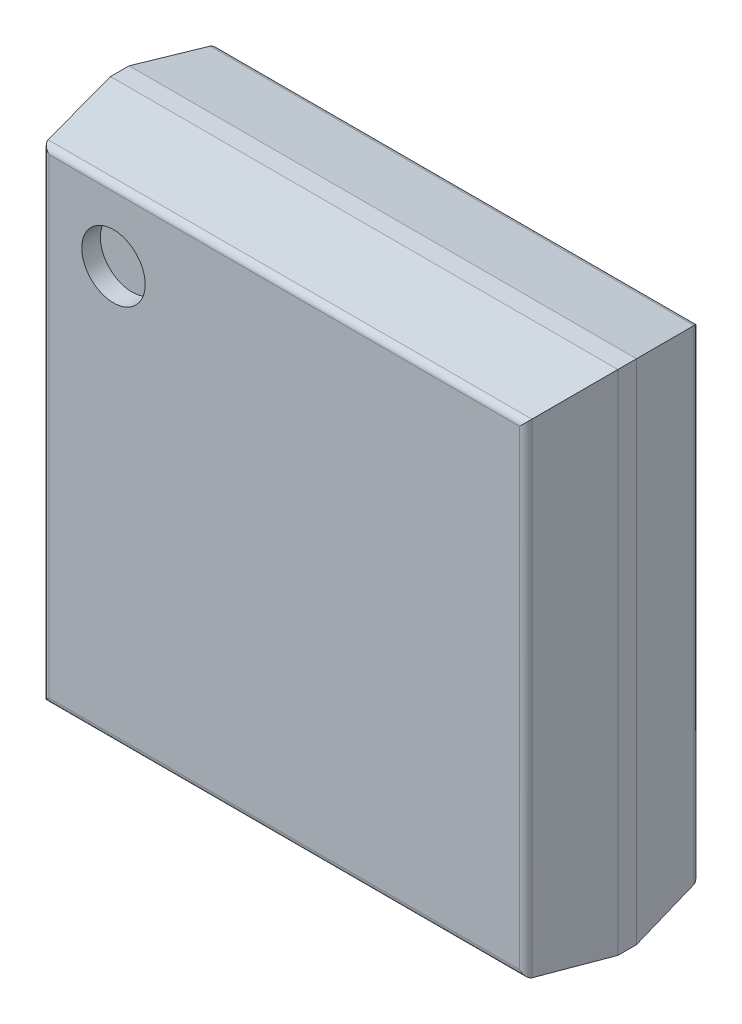
ISO-10303-21;
HEADER;
FILE_DESCRIPTION(('STEP AP214'),'2;1');
FILE_NAME('part.step','',(''),(''),'','','');
FILE_SCHEMA(('AUTOMOTIVE_DESIGN { 1 0 10303 214 1 1 1 1 }'));
ENDSEC;
DATA;
#1=APPLICATION_CONTEXT('core data for automotive mechanical design processes');
#2=APPLICATION_PROTOCOL_DEFINITION('international standard','automotive_design',2000,#1);
#3=PRODUCT_CONTEXT('',#1,'mechanical');
#4=PRODUCT('Part','Part','',(#3));
#5=PRODUCT_RELATED_PRODUCT_CATEGORY('part','',(#4));
#6=PRODUCT_DEFINITION_FORMATION('','',#4);
#7=PRODUCT_DEFINITION_CONTEXT('part definition',#1,'design');
#8=PRODUCT_DEFINITION('design','',#6,#7);
#9=PRODUCT_DEFINITION_SHAPE('','',#8);
#10=(LENGTH_UNIT() NAMED_UNIT(*) SI_UNIT(.MILLI.,.METRE.));
#11=(NAMED_UNIT(*) PLANE_ANGLE_UNIT() SI_UNIT($,.RADIAN.));
#12=(NAMED_UNIT(*) SI_UNIT($,.STERADIAN.) SOLID_ANGLE_UNIT());
#13=UNCERTAINTY_MEASURE_WITH_UNIT(LENGTH_MEASURE(1.E-05),#10,'distance_accuracy_value','');
#14=(GEOMETRIC_REPRESENTATION_CONTEXT(3) GLOBAL_UNCERTAINTY_ASSIGNED_CONTEXT((#13)) GLOBAL_UNIT_ASSIGNED_CONTEXT((#10,
#11,#12)) REPRESENTATION_CONTEXT('',''));
#15=CARTESIAN_POINT('',(0.,0.,0.));
#16=DIRECTION('',(0.,0.,1.));
#17=DIRECTION('',(1.,0.,0.));
#18=AXIS2_PLACEMENT_3D('',#15,#16,#17);
#19=CARTESIAN_POINT('',(-1.01,1.01,0.99));
#20=DIRECTION('',(0.,0.,1.));
#21=DIRECTION('',(1.,0.,0.));
#22=AXIS2_PLACEMENT_3D('',#19,#20,#21);
#23=PLANE('',#22);
#24=CARTESIAN_POINT('',(-1.01,1.01,0.99));
#25=DIRECTION('',(0.,0.,1.));
#26=DIRECTION('',(1.,0.,0.));
#27=AXIS2_PLACEMENT_3D('',#24,#25,#26);
#28=CIRCLE('',#27,0.1875);
#29=CARTESIAN_POINT('',(-0.8225,1.01,0.99));
#30=VERTEX_POINT('',#29);
#31=EDGE_CURVE('E20',#30,#30,#28,.T.);
#32=ORIENTED_EDGE('',*,*,#31,.T.);
#33=EDGE_LOOP('',(#32));
#34=FACE_BOUND('',#33,.T.);
#35=ADVANCED_FACE('F17',(#34),#23,.T.);
#36=CARTESIAN_POINT('',(-1.01,1.01,0.99));
#37=DIRECTION('',(0.,0.,1.));
#38=DIRECTION('',(1.,0.,0.));
#39=AXIS2_PLACEMENT_3D('',#36,#37,#38);
#40=CYLINDRICAL_SURFACE('',#39,0.1875);
#41=CARTESIAN_POINT('',(-1.01,1.01,1.1));
#42=DIRECTION('',(0.,0.,1.));
#43=DIRECTION('',(1.,0.,0.));
#44=AXIS2_PLACEMENT_3D('',#41,#42,#43);
#45=CIRCLE('',#44,0.1875);
#46=CARTESIAN_POINT('',(-0.8225,1.01,1.1));
#47=VERTEX_POINT('',#46);
#48=EDGE_CURVE('E100',#47,#47,#45,.F.);
#49=ORIENTED_EDGE('',*,*,#48,.F.);
#50=EDGE_LOOP('',(#49));
#51=FACE_BOUND('',#50,.T.);
#52=ORIENTED_EDGE('',*,*,#31,.F.);
#53=EDGE_LOOP('',(#52));
#54=FACE_BOUND('',#53,.T.);
#55=ADVANCED_FACE('F117',(#51,#54),#40,.F.);
#56=CARTESIAN_POINT('',(-1.5,-1.5,1.1));
#57=DIRECTION('',(0.,0.,1.));
#58=DIRECTION('',(1.,0.,0.));
#59=AXIS2_PLACEMENT_3D('',#56,#57,#58);
#60=PLANE('',#59);
#61=ORIENTED_EDGE('',*,*,#48,.T.);
#62=EDGE_LOOP('',(#61));
#63=FACE_BOUND('',#62,.T.);
#64=DIRECTION('',(0.,1.,0.));
#65=VECTOR('',#64,1.);
#66=CARTESIAN_POINT('',(1.390851629894,-1.425,1.1));
#67=LINE('',#66,#65);
#68=CARTESIAN_POINT('',(1.390851629894,1.390851629894,1.1));
#69=VERTEX_POINT('',#68);
#70=CARTESIAN_POINT('',(1.390851629894,-1.390851629894,1.1));
#71=VERTEX_POINT('',#70);
#72=EDGE_CURVE('E107',#69,#71,#67,.F.);
#73=ORIENTED_EDGE('',*,*,#72,.F.);
#74=DIRECTION('',(1.,0.,0.));
#75=VECTOR('',#74,1.);
#76=CARTESIAN_POINT('',(-1.425,1.390851629894,1.1));
#77=LINE('',#76,#75);
#78=CARTESIAN_POINT('',(-1.390851629894,1.390851629894,1.1));
#79=VERTEX_POINT('',#78);
#80=EDGE_CURVE('E96',#79,#69,#77,.T.);
#81=ORIENTED_EDGE('',*,*,#80,.F.);
#82=DIRECTION('',(0.,1.,0.));
#83=VECTOR('',#82,1.);
#84=CARTESIAN_POINT('',(-1.390851629894,-1.425,1.1));
#85=LINE('',#84,#83);
#86=CARTESIAN_POINT('',(-1.390851629894,-1.390851629894,1.1));
#87=VERTEX_POINT('',#86);
#88=EDGE_CURVE('E92',#87,#79,#85,.T.);
#89=ORIENTED_EDGE('',*,*,#88,.F.);
#90=DIRECTION('',(1.,0.,0.));
#91=VECTOR('',#90,1.);
#92=CARTESIAN_POINT('',(-1.425,-1.390851629894,1.1));
#93=LINE('',#92,#91);
#94=EDGE_CURVE('E81',#71,#87,#93,.F.);
#95=ORIENTED_EDGE('',*,*,#94,.F.);
#96=EDGE_LOOP('',(#73,#81,#89,#95));
#97=FACE_BOUND('',#96,.T.);
#98=ADVANCED_FACE('F95',(#63,#97),#60,.T.);
#99=CARTESIAN_POINT('',(-1.390851629894,-1.425,1.06));
#100=DIRECTION('',(0.,1.,0.));
#101=DIRECTION('',(0.,0.,1.));
#102=AXIS2_PLACEMENT_3D('',#99,#100,#101);
#103=CYLINDRICAL_SURFACE('',#102,0.04);
#104=CARTESIAN_POINT('',(-1.390851629894,1.390851629894,1.06));
#105=DIRECTION('',(0.707106781186547,0.707106781186547,0.));
#106=DIRECTION('',(0.707106781186547,-0.707106781186547,0.));
#107=AXIS2_PLACEMENT_3D('',#104,#105,#106);
#108=ELLIPSE('',#107,0.0565685424949238,0.04);
#109=CARTESIAN_POINT('',(-1.43035647159894,1.43035647159894,1.06627435111286));
#110=VERTEX_POINT('',#109);
#111=EDGE_CURVE('E414',#110,#79,#108,.T.);
#112=ORIENTED_EDGE('',*,*,#111,.F.);
#113=DIRECTION('',(0.,1.,0.));
#114=VECTOR('',#113,1.);
#115=CARTESIAN_POINT('',(-1.43035647159917,-1.5,1.06627435111303));
#116=LINE('',#115,#114);
#117=CARTESIAN_POINT('',(-1.43035647159894,-1.43035647159894,1.06627435111286));
#118=VERTEX_POINT('',#117);
#119=EDGE_CURVE('E104',#110,#118,#116,.F.);
#120=ORIENTED_EDGE('',*,*,#119,.T.);
#121=CARTESIAN_POINT('',(-1.390851629894,-1.390851629894,1.06));
#122=DIRECTION('',(0.707106781186547,-0.707106781186547,0.));
#123=DIRECTION('',(0.707106781186547,0.707106781186547,0.));
#124=AXIS2_PLACEMENT_3D('',#121,#122,#123);
#125=ELLIPSE('',#124,0.0565685424949238,0.04);
#126=EDGE_CURVE('E86',#87,#118,#125,.T.);
#127=ORIENTED_EDGE('',*,*,#126,.F.);
#128=ORIENTED_EDGE('',*,*,#88,.T.);
#129=EDGE_LOOP('',(#112,#120,#127,#128));
#130=FACE_BOUND('',#129,.T.);
#131=ADVANCED_FACE('F103',(#130),#103,.T.);
#132=CARTESIAN_POINT('',(-1.425,-1.390851629894,1.06));
#133=DIRECTION('',(1.,0.,0.));
#134=DIRECTION('',(0.,0.,-1.));
#135=AXIS2_PLACEMENT_3D('',#132,#133,#134);
#136=CYLINDRICAL_SURFACE('',#135,0.04);
#137=ORIENTED_EDGE('',*,*,#94,.T.);
#138=ORIENTED_EDGE('',*,*,#126,.T.);
#139=DIRECTION('',(1.,0.,0.));
#140=VECTOR('',#139,1.);
#141=CARTESIAN_POINT('',(-1.5,-1.43035647159917,1.06627435111303));
#142=LINE('',#141,#140);
#143=CARTESIAN_POINT('',(1.43035647159894,-1.43035647159894,1.06627435111286));
#144=VERTEX_POINT('',#143);
#145=EDGE_CURVE('E431',#118,#144,#142,.T.);
#146=ORIENTED_EDGE('',*,*,#145,.T.);
#147=CARTESIAN_POINT('',(1.390851629894,-1.390851629894,1.06));
#148=DIRECTION('',(0.707106781186547,0.707106781186547,0.));
#149=DIRECTION('',(-0.707106781186547,0.707106781186547,0.));
#150=AXIS2_PLACEMENT_3D('',#147,#148,#149);
#151=ELLIPSE('',#150,0.0565685424949238,0.04);
#152=EDGE_CURVE('E88',#71,#144,#151,.T.);
#153=ORIENTED_EDGE('',*,*,#152,.F.);
#154=EDGE_LOOP('',(#137,#138,#146,#153));
#155=FACE_BOUND('',#154,.T.);
#156=ADVANCED_FACE('F83',(#155),#136,.T.);
#157=CARTESIAN_POINT('',(1.390851629894,-1.425,1.06));
#158=DIRECTION('',(0.,1.,0.));
#159=DIRECTION('',(0.,0.,1.));
#160=AXIS2_PLACEMENT_3D('',#157,#158,#159);
#161=CYLINDRICAL_SURFACE('',#160,0.04);
#162=CARTESIAN_POINT('',(1.390851629894,1.390851629894,1.06));
#163=DIRECTION('',(0.707106781186547,-0.707106781186547,0.));
#164=DIRECTION('',(0.707106781186547,0.707106781186547,0.));
#165=AXIS2_PLACEMENT_3D('',#162,#163,#164);
#166=ELLIPSE('',#165,0.0565685424949238,0.04);
#167=CARTESIAN_POINT('',(1.43035647159894,1.43035647159894,1.06627435111286));
#168=VERTEX_POINT('',#167);
#169=EDGE_CURVE('E408',#69,#168,#166,.F.);
#170=ORIENTED_EDGE('',*,*,#169,.F.);
#171=ORIENTED_EDGE('',*,*,#72,.T.);
#172=ORIENTED_EDGE('',*,*,#152,.T.);
#173=DIRECTION('',(0.,1.,0.));
#174=VECTOR('',#173,1.);
#175=CARTESIAN_POINT('',(1.43035647159917,-1.5,1.06627435111303));
#176=LINE('',#175,#174);
#177=EDGE_CURVE('E410',#168,#144,#176,.F.);
#178=ORIENTED_EDGE('',*,*,#177,.F.);
#179=EDGE_LOOP('',(#170,#171,#172,#178));
#180=FACE_BOUND('',#179,.T.);
#181=ADVANCED_FACE('F200',(#180),#161,.T.);
#182=CARTESIAN_POINT('',(-1.425,1.390851629894,1.06));
#183=DIRECTION('',(1.,0.,0.));
#184=DIRECTION('',(0.,0.,-1.));
#185=AXIS2_PLACEMENT_3D('',#182,#183,#184);
#186=CYLINDRICAL_SURFACE('',#185,0.04);
#187=DIRECTION('',(1.,0.,0.));
#188=VECTOR('',#187,1.);
#189=CARTESIAN_POINT('',(-1.5,1.43035647159917,1.06627435111303));
#190=LINE('',#189,#188);
#191=EDGE_CURVE('E436',#110,#168,#190,.T.);
#192=ORIENTED_EDGE('',*,*,#191,.F.);
#193=ORIENTED_EDGE('',*,*,#111,.T.);
#194=ORIENTED_EDGE('',*,*,#80,.T.);
#195=ORIENTED_EDGE('',*,*,#169,.T.);
#196=EDGE_LOOP('',(#192,#193,#194,#195));
#197=FACE_BOUND('',#196,.T.);
#198=ADVANCED_FACE('F196',(#197),#186,.T.);
#199=CARTESIAN_POINT('',(-1.4625,-1.5,0.863890872965));
#200=DIRECTION('',(0.987621042617947,0.,-0.156858777816992));
#201=DIRECTION('',(-0.156858777816992,0.,-0.987621042617947));
#202=AXIS2_PLACEMENT_3D('',#199,#200,#201);
#203=PLANE('',#202);
#204=DIRECTION('',(0.154963943611399,-0.154963943610628,0.975690705275522));
#205=VECTOR('',#204,1.);
#206=CARTESIAN_POINT('',(-1.5,1.49999999999982,0.627781745930971));
#207=LINE('',#206,#205);
#208=CARTESIAN_POINT('',(-1.5,1.49999999999995,0.627781745930993));
#209=VERTEX_POINT('',#208);
#210=EDGE_CURVE('E459',#209,#110,#207,.T.);
#211=ORIENTED_EDGE('',*,*,#210,.F.);
#212=DIRECTION('',(0.,1.,0.));
#213=VECTOR('',#212,1.);
#214=CARTESIAN_POINT('',(-1.5,-1.5,0.627781745931));
#215=LINE('',#214,#213);
#216=CARTESIAN_POINT('',(-1.5,-1.49999999999995,0.627781745930993));
#217=VERTEX_POINT('',#216);
#218=EDGE_CURVE('E477',#209,#217,#215,.F.);
#219=ORIENTED_EDGE('',*,*,#218,.T.);
#220=DIRECTION('',(0.154963943611399,0.154963943610628,0.975690705275522));
#221=VECTOR('',#220,1.);
#222=CARTESIAN_POINT('',(-1.5,-1.49999999999982,0.627781745930971));
#223=LINE('',#222,#221);
#224=EDGE_CURVE('E433',#217,#118,#223,.T.);
#225=ORIENTED_EDGE('',*,*,#224,.T.);
#226=ORIENTED_EDGE('',*,*,#119,.F.);
#227=EDGE_LOOP('',(#211,#219,#225,#226));
#228=FACE_BOUND('',#227,.T.);
#229=ADVANCED_FACE('F192',(#228),#203,.F.);
#230=CARTESIAN_POINT('',(-1.5,-1.4625,0.863890872965));
#231=DIRECTION('',(0.,0.987621042617947,-0.156858777816992));
#232=DIRECTION('',(0.,0.156858777816992,0.987621042617947));
#233=AXIS2_PLACEMENT_3D('',#230,#231,#232);
#234=PLANE('',#233);
#235=DIRECTION('',(1.,0.,0.));
#236=VECTOR('',#235,1.);
#237=CARTESIAN_POINT('',(-1.5,-1.5,0.627781745931));
#238=LINE('',#237,#236);
#239=CARTESIAN_POINT('',(1.49999999999995,-1.5,0.627781745930993));
#240=VERTEX_POINT('',#239);
#241=EDGE_CURVE('E446',#217,#240,#238,.T.);
#242=ORIENTED_EDGE('',*,*,#241,.T.);
#243=DIRECTION('',(0.154963943610628,-0.154963943611399,-0.975690705275522));
#244=VECTOR('',#243,1.);
#245=CARTESIAN_POINT('',(1.43035647159917,-1.430356471599,1.06627435111303));
#246=LINE('',#245,#244);
#247=EDGE_CURVE('E437',#144,#240,#246,.T.);
#248=ORIENTED_EDGE('',*,*,#247,.F.);
#249=ORIENTED_EDGE('',*,*,#145,.F.);
#250=ORIENTED_EDGE('',*,*,#224,.F.);
#251=EDGE_LOOP('',(#242,#248,#249,#250));
#252=FACE_BOUND('',#251,.T.);
#253=ADVANCED_FACE('F188',(#252),#234,.F.);
#254=CARTESIAN_POINT('',(1.4625,-1.5,0.863890872965));
#255=DIRECTION('',(0.987621042617947,0.,0.156858777816992));
#256=DIRECTION('',(0.156858777816992,0.,-0.987621042617947));
#257=AXIS2_PLACEMENT_3D('',#254,#255,#256);
#258=PLANE('',#257);
#259=DIRECTION('',(0.154963943611399,0.154963943610628,-0.975690705275522));
#260=VECTOR('',#259,1.);
#261=CARTESIAN_POINT('',(1.430356471599,1.43035647159917,1.06627435111303));
#262=LINE('',#261,#260);
#263=CARTESIAN_POINT('',(1.5,1.49999999999995,0.627781745930993));
#264=VERTEX_POINT('',#263);
#265=EDGE_CURVE('E439',#168,#264,#262,.T.);
#266=ORIENTED_EDGE('',*,*,#265,.F.);
#267=ORIENTED_EDGE('',*,*,#177,.T.);
#268=ORIENTED_EDGE('',*,*,#247,.T.);
#269=DIRECTION('',(0.,1.,0.));
#270=VECTOR('',#269,1.);
#271=CARTESIAN_POINT('',(1.5,-1.5,0.627781745931));
#272=LINE('',#271,#270);
#273=EDGE_CURVE('E462',#264,#240,#272,.F.);
#274=ORIENTED_EDGE('',*,*,#273,.F.);
#275=EDGE_LOOP('',(#266,#267,#268,#274));
#276=FACE_BOUND('',#275,.T.);
#277=ADVANCED_FACE('F184',(#276),#258,.T.);
#278=CARTESIAN_POINT('',(-1.5,1.4625,0.863890872965));
#279=DIRECTION('',(0.,0.987621042617947,0.156858777816992));
#280=DIRECTION('',(0.,-0.156858777816992,0.987621042617947));
#281=AXIS2_PLACEMENT_3D('',#278,#279,#280);
#282=PLANE('',#281);
#283=DIRECTION('',(1.,0.,0.));
#284=VECTOR('',#283,1.);
#285=CARTESIAN_POINT('',(-1.5,1.5,0.627781745931));
#286=LINE('',#285,#284);
#287=EDGE_CURVE('E468',#209,#264,#286,.T.);
#288=ORIENTED_EDGE('',*,*,#287,.F.);
#289=ORIENTED_EDGE('',*,*,#210,.T.);
#290=ORIENTED_EDGE('',*,*,#191,.T.);
#291=ORIENTED_EDGE('',*,*,#265,.T.);
#292=EDGE_LOOP('',(#288,#289,#290,#291));
#293=FACE_BOUND('',#292,.T.);
#294=ADVANCED_FACE('F180',(#293),#282,.T.);
#295=CARTESIAN_POINT('',(-1.5,-1.5,0.075));
#296=DIRECTION('',(1.,0.,0.));
#297=DIRECTION('',(0.,0.,-1.));
#298=AXIS2_PLACEMENT_3D('',#295,#296,#297);
#299=PLANE('',#298);
#300=DIRECTION('',(0.,0.,1.));
#301=VECTOR('',#300,1.);
#302=CARTESIAN_POINT('',(-1.5,1.5,0.075));
#303=LINE('',#302,#301);
#304=CARTESIAN_POINT('',(-1.50000000000005,1.50000000000014,0.517781745930976));
#305=VERTEX_POINT('',#304);
#306=EDGE_CURVE('E472',#305,#209,#303,.T.);
#307=ORIENTED_EDGE('',*,*,#306,.F.);
#308=DIRECTION('',(0.,1.,0.));
#309=VECTOR('',#308,1.);
#310=CARTESIAN_POINT('',(-1.50000000000019,-1.5,0.517781745930968));
#311=LINE('',#310,#309);
#312=CARTESIAN_POINT('',(-1.50000000000005,-1.50000000000009,0.517781745930976));
#313=VERTEX_POINT('',#312);
#314=EDGE_CURVE('E471',#313,#305,#311,.T.);
#315=ORIENTED_EDGE('',*,*,#314,.F.);
#316=DIRECTION('',(0.,0.,1.));
#317=VECTOR('',#316,1.);
#318=CARTESIAN_POINT('',(-1.5,-1.5,0.075));
#319=LINE('',#318,#317);
#320=EDGE_CURVE('E450',#313,#217,#319,.T.);
#321=ORIENTED_EDGE('',*,*,#320,.T.);
#322=ORIENTED_EDGE('',*,*,#218,.F.);
#323=EDGE_LOOP('',(#307,#315,#321,#322));
#324=FACE_BOUND('',#323,.T.);
#325=ADVANCED_FACE('F176',(#324),#299,.F.);
#326=CARTESIAN_POINT('',(-1.5,-1.5,0.075));
#327=DIRECTION('',(0.,1.,0.));
#328=DIRECTION('',(0.,0.,1.));
#329=AXIS2_PLACEMENT_3D('',#326,#327,#328);
#330=PLANE('',#329);
#331=ORIENTED_EDGE('',*,*,#320,.F.);
#332=DIRECTION('',(1.,0.,0.));
#333=VECTOR('',#332,1.);
#334=CARTESIAN_POINT('',(-1.5,-1.50000000000019,0.517781745930968));
#335=LINE('',#334,#333);
#336=CARTESIAN_POINT('',(1.50000000000009,-1.50000000000005,0.517781745930968));
#337=VERTEX_POINT('',#336);
#338=EDGE_CURVE('E488',#337,#313,#335,.F.);
#339=ORIENTED_EDGE('',*,*,#338,.F.);
#340=DIRECTION('',(0.,0.,-1.));
#341=VECTOR('',#340,1.);
#342=CARTESIAN_POINT('',(1.5,-1.5,0.075));
#343=LINE('',#342,#341);
#344=EDGE_CURVE('E449',#240,#337,#343,.T.);
#345=ORIENTED_EDGE('',*,*,#344,.F.);
#346=ORIENTED_EDGE('',*,*,#241,.F.);
#347=EDGE_LOOP('',(#331,#339,#345,#346));
#348=FACE_BOUND('',#347,.T.);
#349=ADVANCED_FACE('F172',(#348),#330,.F.);
#350=CARTESIAN_POINT('',(1.5,-1.5,0.075));
#351=DIRECTION('',(1.,0.,0.));
#352=DIRECTION('',(0.,0.,-1.));
#353=AXIS2_PLACEMENT_3D('',#350,#351,#352);
#354=PLANE('',#353);
#355=DIRECTION('',(0.,0.,1.));
#356=VECTOR('',#355,1.);
#357=CARTESIAN_POINT('',(1.5,1.5,0.075));
#358=LINE('',#357,#356);
#359=CARTESIAN_POINT('',(1.50000000000005,1.50000000000009,0.517781745930968));
#360=VERTEX_POINT('',#359);
#361=EDGE_CURVE('E465',#264,#360,#358,.F.);
#362=ORIENTED_EDGE('',*,*,#361,.F.);
#363=ORIENTED_EDGE('',*,*,#273,.T.);
#364=ORIENTED_EDGE('',*,*,#344,.T.);
#365=DIRECTION('',(0.,1.,0.));
#366=VECTOR('',#365,1.);
#367=CARTESIAN_POINT('',(1.50000000000019,-1.5,0.517781745930968));
#368=LINE('',#367,#366);
#369=EDGE_CURVE('E498',#337,#360,#368,.T.);
#370=ORIENTED_EDGE('',*,*,#369,.T.);
#371=EDGE_LOOP('',(#362,#363,#364,#370));
#372=FACE_BOUND('',#371,.T.);
#373=ADVANCED_FACE('F168',(#372),#354,.T.);
#374=CARTESIAN_POINT('',(-1.5,1.5,0.075));
#375=DIRECTION('',(0.,1.,0.));
#376=DIRECTION('',(0.,0.,1.));
#377=AXIS2_PLACEMENT_3D('',#374,#375,#376);
#378=PLANE('',#377);
#379=ORIENTED_EDGE('',*,*,#306,.T.);
#380=ORIENTED_EDGE('',*,*,#287,.T.);
#381=ORIENTED_EDGE('',*,*,#361,.T.);
#382=DIRECTION('',(1.,0.,0.));
#383=VECTOR('',#382,1.);
#384=CARTESIAN_POINT('',(-1.5,1.50000000000019,0.517781745930968));
#385=LINE('',#384,#383);
#386=EDGE_CURVE('E513',#360,#305,#385,.F.);
#387=ORIENTED_EDGE('',*,*,#386,.T.);
#388=EDGE_LOOP('',(#379,#380,#381,#387));
#389=FACE_BOUND('',#388,.T.);
#390=ADVANCED_FACE('F164',(#389),#378,.T.);
#391=CARTESIAN_POINT('',(-1.4625,-1.5,0.296390872965));
#392=DIRECTION('',(-0.985956071695129,0.,-0.167004864263022));
#393=DIRECTION('',(-0.167004864263022,0.,0.985956071695129));
#394=AXIS2_PLACEMENT_3D('',#391,#392,#393);
#395=PLANE('',#394);
#396=DIRECTION('',(0.164723540532164,-0.164723540532956,-0.972487691638736));
#397=VECTOR('',#396,1.);
#398=CARTESIAN_POINT('',(-1.5,1.50000000000019,0.517781745930968));
#399=LINE('',#398,#397);
#400=CARTESIAN_POINT('',(-1.4306438311429,1.4306438311428,0.108319805429265));
#401=VERTEX_POINT('',#400);
#402=EDGE_CURVE('E516',#305,#401,#399,.T.);
#403=ORIENTED_EDGE('',*,*,#402,.T.);
#404=DIRECTION('',(0.,1.,0.));
#405=VECTOR('',#404,1.);
#406=CARTESIAN_POINT('',(-1.43064383114273,-1.425,0.108319805429045));
#407=LINE('',#406,#405);
#408=CARTESIAN_POINT('',(-1.4306438311429,-1.4306438311428,0.108319805429265));
#409=VERTEX_POINT('',#408);
#410=EDGE_CURVE('E421',#409,#401,#407,.T.);
#411=ORIENTED_EDGE('',*,*,#410,.F.);
#412=DIRECTION('',(0.164723540532164,0.164723540532956,-0.972487691638736));
#413=VECTOR('',#412,1.);
#414=CARTESIAN_POINT('',(-1.5,-1.50000000000019,0.517781745930968));
#415=LINE('',#414,#413);
#416=EDGE_CURVE('E491',#313,#409,#415,.T.);
#417=ORIENTED_EDGE('',*,*,#416,.F.);
#418=ORIENTED_EDGE('',*,*,#314,.T.);
#419=EDGE_LOOP('',(#403,#411,#417,#418));
#420=FACE_BOUND('',#419,.T.);
#421=ADVANCED_FACE('F160',(#420),#395,.T.);
#422=CARTESIAN_POINT('',(-1.5,-1.4625,0.296390872965));
#423=DIRECTION('',(0.,-0.985956071695129,-0.167004864263022));
#424=DIRECTION('',(0.,0.167004864263022,-0.985956071695129));
#425=AXIS2_PLACEMENT_3D('',#422,#423,#424);
#426=PLANE('',#425);
#427=ORIENTED_EDGE('',*,*,#338,.T.);
#428=ORIENTED_EDGE('',*,*,#416,.T.);
#429=DIRECTION('',(1.,0.,0.));
#430=VECTOR('',#429,1.);
#431=CARTESIAN_POINT('',(-1.425,-1.43064383114273,0.108319805429045));
#432=LINE('',#431,#430);
#433=CARTESIAN_POINT('',(1.4306438311428,-1.4306438311429,0.108319805429265));
#434=VERTEX_POINT('',#433);
#435=EDGE_CURVE('E420',#434,#409,#432,.F.);
#436=ORIENTED_EDGE('',*,*,#435,.F.);
#437=DIRECTION('',(0.164723540532956,-0.164723540532164,0.972487691638736));
#438=VECTOR('',#437,1.);
#439=CARTESIAN_POINT('',(1.43064383114286,-1.430643831143,0.108319805429025));
#440=LINE('',#439,#438);
#441=EDGE_CURVE('E502',#434,#337,#440,.T.);
#442=ORIENTED_EDGE('',*,*,#441,.T.);
#443=EDGE_LOOP('',(#427,#428,#436,#442));
#444=FACE_BOUND('',#443,.T.);
#445=ADVANCED_FACE('F156',(#444),#426,.T.);
#446=CARTESIAN_POINT('',(1.4625,-1.5,0.296390872965));
#447=DIRECTION('',(-0.985956071695129,0.,0.167004864263022));
#448=DIRECTION('',(0.167004864263022,0.,0.985956071695129));
#449=AXIS2_PLACEMENT_3D('',#446,#447,#448);
#450=PLANE('',#449);
#451=DIRECTION('',(0.164723540532164,0.164723540532956,0.972487691638736));
#452=VECTOR('',#451,1.);
#453=CARTESIAN_POINT('',(1.430643831143,1.43064383114286,0.108319805429025));
#454=LINE('',#453,#452);
#455=CARTESIAN_POINT('',(1.4306438311429,1.4306438311428,0.108319805429265));
#456=VERTEX_POINT('',#455);
#457=EDGE_CURVE('E501',#456,#360,#454,.T.);
#458=ORIENTED_EDGE('',*,*,#457,.T.);
#459=ORIENTED_EDGE('',*,*,#369,.F.);
#460=ORIENTED_EDGE('',*,*,#441,.F.);
#461=DIRECTION('',(0.,1.,0.));
#462=VECTOR('',#461,1.);
#463=CARTESIAN_POINT('',(1.43064383114273,-1.425,0.108319805429045));
#464=LINE('',#463,#462);
#465=EDGE_CURVE('E425',#456,#434,#464,.F.);
#466=ORIENTED_EDGE('',*,*,#465,.F.);
#467=EDGE_LOOP('',(#458,#459,#460,#466));
#468=FACE_BOUND('',#467,.T.);
#469=ADVANCED_FACE('F152',(#468),#450,.F.);
#470=CARTESIAN_POINT('',(-1.5,1.4625,0.296390872965));
#471=DIRECTION('',(0.,-0.985956071695129,0.167004864263022));
#472=DIRECTION('',(0.,-0.167004864263022,-0.985956071695129));
#473=AXIS2_PLACEMENT_3D('',#470,#471,#472);
#474=PLANE('',#473);
#475=ORIENTED_EDGE('',*,*,#386,.F.);
#476=ORIENTED_EDGE('',*,*,#457,.F.);
#477=DIRECTION('',(1.,0.,0.));
#478=VECTOR('',#477,1.);
#479=CARTESIAN_POINT('',(-1.425,1.43064383114273,0.108319805429045));
#480=LINE('',#479,#478);
#481=EDGE_CURVE('E428',#401,#456,#480,.T.);
#482=ORIENTED_EDGE('',*,*,#481,.F.);
#483=ORIENTED_EDGE('',*,*,#402,.F.);
#484=EDGE_LOOP('',(#475,#476,#482,#483));
#485=FACE_BOUND('',#484,.T.);
#486=ADVANCED_FACE('F148',(#485),#474,.F.);
#487=CARTESIAN_POINT('',(-1.391205588275,-1.425,0.115));
#488=DIRECTION('',(0.,1.,0.));
#489=DIRECTION('',(0.,0.,1.));
#490=AXIS2_PLACEMENT_3D('',#487,#488,#489);
#491=CYLINDRICAL_SURFACE('',#490,0.04);
#492=DIRECTION('',(0.,1.,0.));
#493=VECTOR('',#492,1.);
#494=CARTESIAN_POINT('',(-1.391205588275,-1.5,0.075));
#495=LINE('',#494,#493);
#496=CARTESIAN_POINT('',(-1.391205588275,1.391205588275,0.075));
#497=VERTEX_POINT('',#496);
#498=CARTESIAN_POINT('',(-1.391205588275,-1.391205588275,0.075));
#499=VERTEX_POINT('',#498);
#500=EDGE_CURVE('E429',#497,#499,#495,.F.);
#501=ORIENTED_EDGE('',*,*,#500,.T.);
#502=CARTESIAN_POINT('',(-1.391205588275,-1.391205588275,0.115));
#503=DIRECTION('',(0.707106781186547,-0.707106781186547,0.));
#504=DIRECTION('',(0.707106781186547,0.707106781186547,0.));
#505=AXIS2_PLACEMENT_3D('',#502,#503,#504);
#506=ELLIPSE('',#505,0.0565685424949238,0.04);
#507=EDGE_CURVE('E418',#409,#499,#506,.T.);
#508=ORIENTED_EDGE('',*,*,#507,.F.);
#509=ORIENTED_EDGE('',*,*,#410,.T.);
#510=CARTESIAN_POINT('',(-1.391205588275,1.391205588275,0.115));
#511=DIRECTION('',(0.707106781186547,0.707106781186547,0.));
#512=DIRECTION('',(0.707106781186547,-0.707106781186547,0.));
#513=AXIS2_PLACEMENT_3D('',#510,#511,#512);
#514=ELLIPSE('',#513,0.0565685424949238,0.04);
#515=EDGE_CURVE('E424',#497,#401,#514,.T.);
#516=ORIENTED_EDGE('',*,*,#515,.F.);
#517=EDGE_LOOP('',(#501,#508,#509,#516));
#518=FACE_BOUND('',#517,.T.);
#519=ADVANCED_FACE('F144',(#518),#491,.T.);
#520=CARTESIAN_POINT('',(-1.425,-1.391205588275,0.115));
#521=DIRECTION('',(1.,0.,0.));
#522=DIRECTION('',(0.,0.,-1.));
#523=AXIS2_PLACEMENT_3D('',#520,#521,#522);
#524=CYLINDRICAL_SURFACE('',#523,0.04);
#525=CARTESIAN_POINT('',(1.391205588275,-1.391205588275,0.115));
#526=DIRECTION('',(0.707106781186547,0.707106781186547,0.));
#527=DIRECTION('',(-0.707106781186547,0.707106781186547,0.));
#528=AXIS2_PLACEMENT_3D('',#525,#526,#527);
#529=ELLIPSE('',#528,0.0565685424949238,0.04);
#530=CARTESIAN_POINT('',(1.391205588275,-1.391205588275,0.075));
#531=VERTEX_POINT('',#530);
#532=EDGE_CURVE('E422',#434,#531,#529,.T.);
#533=ORIENTED_EDGE('',*,*,#532,.F.);
#534=ORIENTED_EDGE('',*,*,#435,.T.);
#535=ORIENTED_EDGE('',*,*,#507,.T.);
#536=DIRECTION('',(1.,0.,0.));
#537=VECTOR('',#536,1.);
#538=CARTESIAN_POINT('',(-1.5,-1.391205588275,0.075));
#539=LINE('',#538,#537);
#540=EDGE_CURVE('E539',#499,#531,#539,.T.);
#541=ORIENTED_EDGE('',*,*,#540,.T.);
#542=EDGE_LOOP('',(#533,#534,#535,#541));
#543=FACE_BOUND('',#542,.T.);
#544=ADVANCED_FACE('F140',(#543),#524,.T.);
#545=CARTESIAN_POINT('',(1.391205588275,-1.425,0.115));
#546=DIRECTION('',(0.,1.,0.));
#547=DIRECTION('',(0.,0.,1.));
#548=AXIS2_PLACEMENT_3D('',#545,#546,#547);
#549=CYLINDRICAL_SURFACE('',#548,0.04);
#550=ORIENTED_EDGE('',*,*,#465,.T.);
#551=ORIENTED_EDGE('',*,*,#532,.T.);
#552=DIRECTION('',(0.,1.,0.));
#553=VECTOR('',#552,1.);
#554=CARTESIAN_POINT('',(1.391205588275,-1.5,0.075));
#555=LINE('',#554,#553);
#556=CARTESIAN_POINT('',(1.391205588275,1.391205588275,0.075));
#557=VERTEX_POINT('',#556);
#558=EDGE_CURVE('E26',#531,#557,#555,.T.);
#559=ORIENTED_EDGE('',*,*,#558,.T.);
#560=CARTESIAN_POINT('',(1.391205588275,1.391205588275,0.115));
#561=DIRECTION('',(0.707106781186547,-0.707106781186547,0.));
#562=DIRECTION('',(0.707106781186547,0.707106781186547,0.));
#563=AXIS2_PLACEMENT_3D('',#560,#561,#562);
#564=ELLIPSE('',#563,0.0565685424949238,0.04);
#565=EDGE_CURVE('E34',#456,#557,#564,.F.);
#566=ORIENTED_EDGE('',*,*,#565,.F.);
#567=EDGE_LOOP('',(#550,#551,#559,#566));
#568=FACE_BOUND('',#567,.T.);
#569=ADVANCED_FACE('F134',(#568),#549,.T.);
#570=CARTESIAN_POINT('',(-1.425,1.391205588275,0.115));
#571=DIRECTION('',(1.,0.,0.));
#572=DIRECTION('',(0.,0.,-1.));
#573=AXIS2_PLACEMENT_3D('',#570,#571,#572);
#574=CYLINDRICAL_SURFACE('',#573,0.04);
#575=ORIENTED_EDGE('',*,*,#565,.T.);
#576=DIRECTION('',(1.,0.,0.));
#577=VECTOR('',#576,1.);
#578=CARTESIAN_POINT('',(-1.5,1.391205588275,0.075));
#579=LINE('',#578,#577);
#580=EDGE_CURVE('E11',#557,#497,#579,.F.);
#581=ORIENTED_EDGE('',*,*,#580,.T.);
#582=ORIENTED_EDGE('',*,*,#515,.T.);
#583=ORIENTED_EDGE('',*,*,#481,.T.);
#584=EDGE_LOOP('',(#575,#581,#582,#583));
#585=FACE_BOUND('',#584,.T.);
#586=ADVANCED_FACE('F128',(#585),#574,.T.);
#587=CARTESIAN_POINT('',(-1.5,-1.5,0.075));
#588=DIRECTION('',(0.,0.,1.));
#589=DIRECTION('',(1.,0.,0.));
#590=AXIS2_PLACEMENT_3D('',#587,#588,#589);
#591=PLANE('',#590);
#592=ORIENTED_EDGE('',*,*,#558,.F.);
#593=ORIENTED_EDGE('',*,*,#540,.F.);
#594=ORIENTED_EDGE('',*,*,#500,.F.);
#595=ORIENTED_EDGE('',*,*,#580,.F.);
#596=EDGE_LOOP('',(#592,#593,#594,#595));
#597=FACE_BOUND('',#596,.T.);
#598=ADVANCED_FACE('F126',(#597),#591,.F.);
#599=CLOSED_SHELL('',(#35,#55,#98,#131,#156,#181,#198,#229,#253,#277,#294,#325,#349,#373,#390,
#421,#445,#469,#486,#519,#544,#569,#586,#598));
#600=MANIFOLD_SOLID_BREP('B1',#599);
#601=ADVANCED_BREP_SHAPE_REPRESENTATION('',(#18,#600),#14);
#602=SHAPE_DEFINITION_REPRESENTATION(#9,#601);
ENDSEC;
END-ISO-10303-21;
